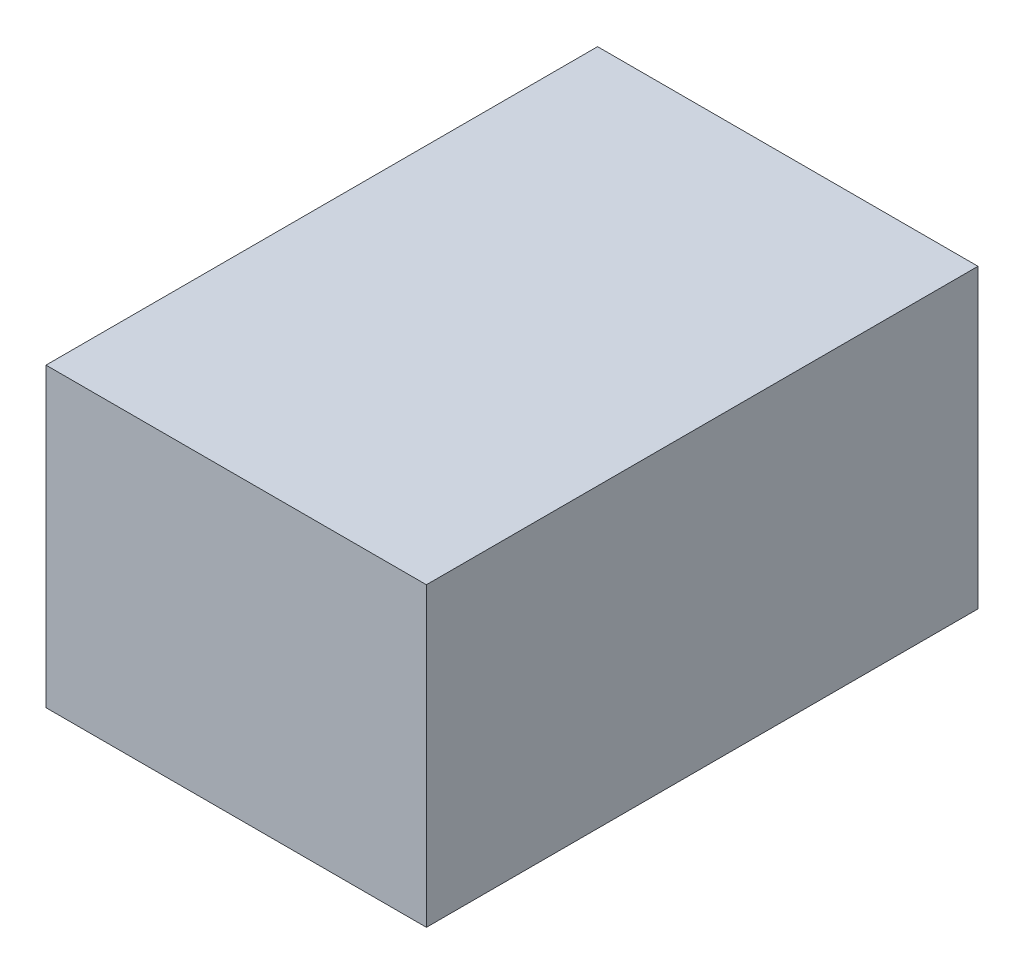
ISO-10303-21;
HEADER;
FILE_DESCRIPTION(('STEP AP214'),'2;1');
FILE_NAME('part.step','',(''),(''),'','','');
FILE_SCHEMA(('AUTOMOTIVE_DESIGN { 1 0 10303 214 1 1 1 1 }'));
ENDSEC;
DATA;
#1=APPLICATION_CONTEXT('core data for automotive mechanical design processes');
#2=APPLICATION_PROTOCOL_DEFINITION('international standard','automotive_design',2000,#1);
#3=PRODUCT_CONTEXT('',#1,'mechanical');
#4=PRODUCT('Part','Part','',(#3));
#5=PRODUCT_RELATED_PRODUCT_CATEGORY('part','',(#4));
#6=PRODUCT_DEFINITION_FORMATION('','',#4);
#7=PRODUCT_DEFINITION_CONTEXT('part definition',#1,'design');
#8=PRODUCT_DEFINITION('design','',#6,#7);
#9=PRODUCT_DEFINITION_SHAPE('','',#8);
#10=(LENGTH_UNIT() NAMED_UNIT(*) SI_UNIT(.MILLI.,.METRE.));
#11=(NAMED_UNIT(*) PLANE_ANGLE_UNIT() SI_UNIT($,.RADIAN.));
#12=(NAMED_UNIT(*) SI_UNIT($,.STERADIAN.) SOLID_ANGLE_UNIT());
#13=UNCERTAINTY_MEASURE_WITH_UNIT(LENGTH_MEASURE(1.E-05),#10,'distance_accuracy_value','');
#14=(GEOMETRIC_REPRESENTATION_CONTEXT(3) GLOBAL_UNCERTAINTY_ASSIGNED_CONTEXT((#13)) GLOBAL_UNIT_ASSIGNED_CONTEXT((#10,
#11,#12)) REPRESENTATION_CONTEXT('',''));
#15=CARTESIAN_POINT('',(0.,0.,0.));
#16=DIRECTION('',(0.,0.,1.));
#17=DIRECTION('',(1.,0.,0.));
#18=AXIS2_PLACEMENT_3D('',#15,#16,#17);
#19=CARTESIAN_POINT('',(50.,78.,72.5));
#20=DIRECTION('',(-1.,0.,0.));
#21=DIRECTION('',(0.,0.,1.));
#22=AXIS2_PLACEMENT_3D('',#19,#20,#21);
#23=PLANE('',#22);
#24=DIRECTION('',(0.,0.,-1.));
#25=VECTOR('',#24,1.);
#26=CARTESIAN_POINT('',(50.,0.,72.5));
#27=LINE('',#26,#25);
#28=CARTESIAN_POINT('',(50.,0.,72.5));
#29=VERTEX_POINT('',#28);
#30=CARTESIAN_POINT('',(50.,0.,-72.5));
#31=VERTEX_POINT('',#30);
#32=EDGE_CURVE('E105',#29,#31,#27,.T.);
#33=ORIENTED_EDGE('',*,*,#32,.T.);
#34=DIRECTION('',(0.,-1.,0.));
#35=VECTOR('',#34,1.);
#36=CARTESIAN_POINT('',(50.,78.,-72.5));
#37=LINE('',#36,#35);
#38=CARTESIAN_POINT('',(50.,78.,-72.5));
#39=VERTEX_POINT('',#38);
#40=EDGE_CURVE('E11',#39,#31,#37,.T.);
#41=ORIENTED_EDGE('',*,*,#40,.F.);
#42=DIRECTION('',(0.,0.,-1.));
#43=VECTOR('',#42,1.);
#44=CARTESIAN_POINT('',(50.,78.,72.5));
#45=LINE('',#44,#43);
#46=CARTESIAN_POINT('',(50.,78.,72.5));
#47=VERTEX_POINT('',#46);
#48=EDGE_CURVE('E88',#47,#39,#45,.T.);
#49=ORIENTED_EDGE('',*,*,#48,.F.);
#50=DIRECTION('',(0.,-1.,0.));
#51=VECTOR('',#50,1.);
#52=CARTESIAN_POINT('',(50.,78.,72.5));
#53=LINE('',#52,#51);
#54=EDGE_CURVE('E101',#47,#29,#53,.T.);
#55=ORIENTED_EDGE('',*,*,#54,.T.);
#56=EDGE_LOOP('',(#33,#41,#49,#55));
#57=FACE_BOUND('',#56,.T.);
#58=ADVANCED_FACE('F36',(#57),#23,.F.);
#59=CARTESIAN_POINT('',(-50.,78.,-72.5));
#60=DIRECTION('',(0.,0.,1.));
#61=DIRECTION('',(1.,0.,0.));
#62=AXIS2_PLACEMENT_3D('',#59,#60,#61);
#63=PLANE('',#62);
#64=DIRECTION('',(-1.,0.,0.));
#65=VECTOR('',#64,1.);
#66=CARTESIAN_POINT('',(-50.,0.,-72.5));
#67=LINE('',#66,#65);
#68=CARTESIAN_POINT('',(-50.,0.,-72.5));
#69=VERTEX_POINT('',#68);
#70=EDGE_CURVE('E93',#31,#69,#67,.T.);
#71=ORIENTED_EDGE('',*,*,#70,.T.);
#72=DIRECTION('',(0.,-1.,0.));
#73=VECTOR('',#72,1.);
#74=CARTESIAN_POINT('',(-50.,78.,-72.5));
#75=LINE('',#74,#73);
#76=CARTESIAN_POINT('',(-50.,78.,-72.5));
#77=VERTEX_POINT('',#76);
#78=EDGE_CURVE('E45',#77,#69,#75,.T.);
#79=ORIENTED_EDGE('',*,*,#78,.F.);
#80=DIRECTION('',(-1.,0.,0.));
#81=VECTOR('',#80,1.);
#82=CARTESIAN_POINT('',(-50.,78.,-72.5));
#83=LINE('',#82,#81);
#84=EDGE_CURVE('E83',#39,#77,#83,.T.);
#85=ORIENTED_EDGE('',*,*,#84,.F.);
#86=ORIENTED_EDGE('',*,*,#40,.T.);
#87=EDGE_LOOP('',(#71,#79,#85,#86));
#88=FACE_BOUND('',#87,.T.);
#89=ADVANCED_FACE('F92',(#88),#63,.F.);
#90=CARTESIAN_POINT('',(-50.,78.,72.5));
#91=DIRECTION('',(1.,0.,0.));
#92=DIRECTION('',(0.,0.,-1.));
#93=AXIS2_PLACEMENT_3D('',#90,#91,#92);
#94=PLANE('',#93);
#95=DIRECTION('',(0.,0.,1.));
#96=VECTOR('',#95,1.);
#97=CARTESIAN_POINT('',(-50.,0.,72.5));
#98=LINE('',#97,#96);
#99=CARTESIAN_POINT('',(-50.,0.,72.5));
#100=VERTEX_POINT('',#99);
#101=EDGE_CURVE('E70',#69,#100,#98,.T.);
#102=ORIENTED_EDGE('',*,*,#101,.T.);
#103=DIRECTION('',(0.,-1.,0.));
#104=VECTOR('',#103,1.);
#105=CARTESIAN_POINT('',(-50.,78.,72.5));
#106=LINE('',#105,#104);
#107=CARTESIAN_POINT('',(-50.,78.,72.5));
#108=VERTEX_POINT('',#107);
#109=EDGE_CURVE('E95',#108,#100,#106,.T.);
#110=ORIENTED_EDGE('',*,*,#109,.F.);
#111=DIRECTION('',(0.,0.,1.));
#112=VECTOR('',#111,1.);
#113=CARTESIAN_POINT('',(-50.,78.,72.5));
#114=LINE('',#113,#112);
#115=EDGE_CURVE('E86',#77,#108,#114,.T.);
#116=ORIENTED_EDGE('',*,*,#115,.F.);
#117=ORIENTED_EDGE('',*,*,#78,.T.);
#118=EDGE_LOOP('',(#102,#110,#116,#117));
#119=FACE_BOUND('',#118,.T.);
#120=ADVANCED_FACE('F96',(#119),#94,.F.);
#121=CARTESIAN_POINT('',(-50.,78.,72.5));
#122=DIRECTION('',(0.,0.,-1.));
#123=DIRECTION('',(-1.,0.,0.));
#124=AXIS2_PLACEMENT_3D('',#121,#122,#123);
#125=PLANE('',#124);
#126=DIRECTION('',(1.,0.,0.));
#127=VECTOR('',#126,1.);
#128=CARTESIAN_POINT('',(-50.,0.,72.5));
#129=LINE('',#128,#127);
#130=EDGE_CURVE('E76',#100,#29,#129,.T.);
#131=ORIENTED_EDGE('',*,*,#130,.T.);
#132=ORIENTED_EDGE('',*,*,#54,.F.);
#133=DIRECTION('',(1.,0.,0.));
#134=VECTOR('',#133,1.);
#135=CARTESIAN_POINT('',(-50.,78.,72.5));
#136=LINE('',#135,#134);
#137=EDGE_CURVE('E53',#108,#47,#136,.T.);
#138=ORIENTED_EDGE('',*,*,#137,.F.);
#139=ORIENTED_EDGE('',*,*,#109,.T.);
#140=EDGE_LOOP('',(#131,#132,#138,#139));
#141=FACE_BOUND('',#140,.T.);
#142=ADVANCED_FACE('F118',(#141),#125,.F.);
#143=CARTESIAN_POINT('',(0.,78.,0.));
#144=DIRECTION('',(0.,-1.,0.));
#145=DIRECTION('',(0.,0.,-1.));
#146=AXIS2_PLACEMENT_3D('',#143,#144,#145);
#147=PLANE('',#146);
#148=ORIENTED_EDGE('',*,*,#48,.T.);
#149=ORIENTED_EDGE('',*,*,#84,.T.);
#150=ORIENTED_EDGE('',*,*,#115,.T.);
#151=ORIENTED_EDGE('',*,*,#137,.T.);
#152=EDGE_LOOP('',(#148,#149,#150,#151));
#153=FACE_BOUND('',#152,.T.);
#154=ADVANCED_FACE('F84',(#153),#147,.F.);
#155=CARTESIAN_POINT('',(0.,0.,0.));
#156=DIRECTION('',(0.,-1.,0.));
#157=DIRECTION('',(0.,0.,-1.));
#158=AXIS2_PLACEMENT_3D('',#155,#156,#157);
#159=PLANE('',#158);
#160=ORIENTED_EDGE('',*,*,#32,.F.);
#161=ORIENTED_EDGE('',*,*,#130,.F.);
#162=ORIENTED_EDGE('',*,*,#101,.F.);
#163=ORIENTED_EDGE('',*,*,#70,.F.);
#164=EDGE_LOOP('',(#160,#161,#162,#163));
#165=FACE_BOUND('',#164,.T.);
#166=ADVANCED_FACE('F121',(#165),#159,.T.);
#167=CLOSED_SHELL('',(#58,#89,#120,#142,#154,#166));
#168=MANIFOLD_SOLID_BREP('B2',#167);
#169=ADVANCED_BREP_SHAPE_REPRESENTATION('',(#18,#168),#14);
#170=SHAPE_DEFINITION_REPRESENTATION(#9,#169);
ENDSEC;
END-ISO-10303-21;
